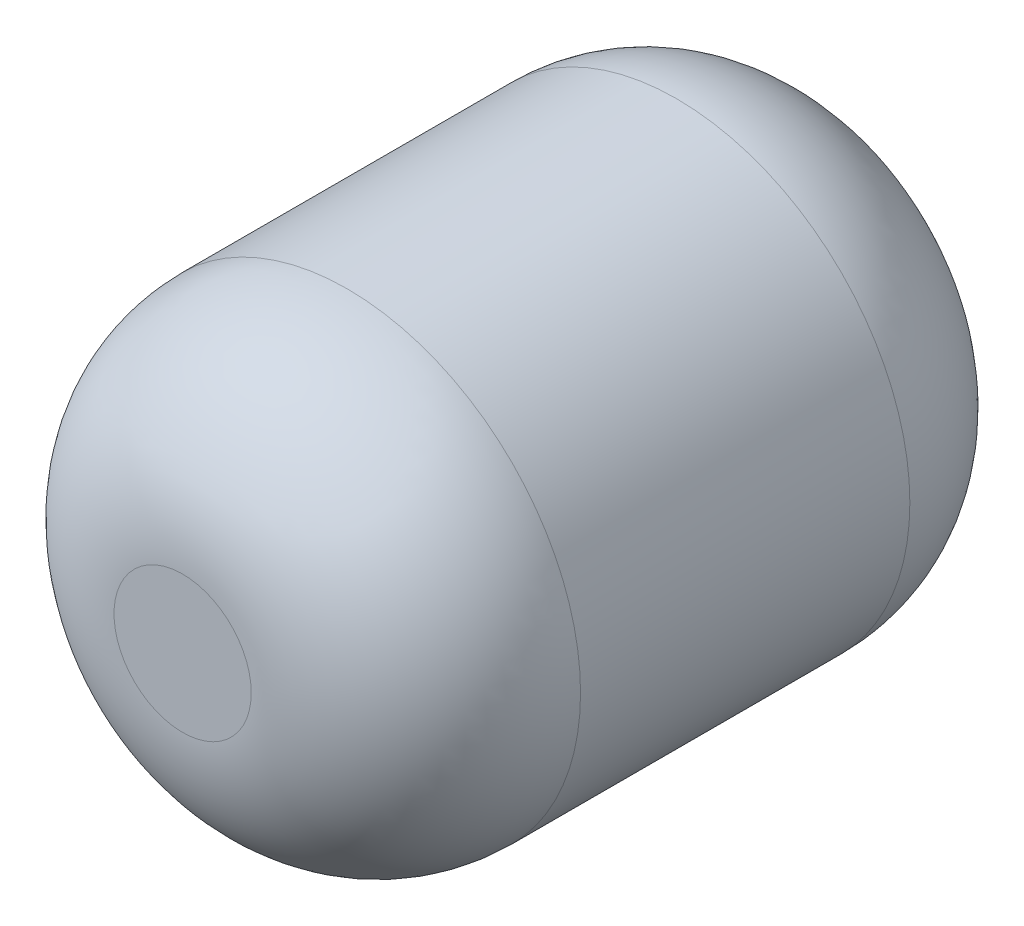
ISO-10303-21;
HEADER;
FILE_DESCRIPTION(('STEP AP214'),'2;1');
FILE_NAME('part.step','',(''),(''),'','','');
FILE_SCHEMA(('AUTOMOTIVE_DESIGN { 1 0 10303 214 1 1 1 1 }'));
ENDSEC;
DATA;
#1=APPLICATION_CONTEXT('core data for automotive mechanical design processes');
#2=APPLICATION_PROTOCOL_DEFINITION('international standard','automotive_design',2000,#1);
#3=PRODUCT_CONTEXT('',#1,'mechanical');
#4=PRODUCT('Part','Part','',(#3));
#5=PRODUCT_RELATED_PRODUCT_CATEGORY('part','',(#4));
#6=PRODUCT_DEFINITION_FORMATION('','',#4);
#7=PRODUCT_DEFINITION_CONTEXT('part definition',#1,'design');
#8=PRODUCT_DEFINITION('design','',#6,#7);
#9=PRODUCT_DEFINITION_SHAPE('','',#8);
#10=(LENGTH_UNIT() NAMED_UNIT(*) SI_UNIT(.MILLI.,.METRE.));
#11=(NAMED_UNIT(*) PLANE_ANGLE_UNIT() SI_UNIT($,.RADIAN.));
#12=(NAMED_UNIT(*) SI_UNIT($,.STERADIAN.) SOLID_ANGLE_UNIT());
#13=UNCERTAINTY_MEASURE_WITH_UNIT(LENGTH_MEASURE(1.E-05),#10,'distance_accuracy_value','');
#14=(GEOMETRIC_REPRESENTATION_CONTEXT(3) GLOBAL_UNCERTAINTY_ASSIGNED_CONTEXT((#13)) GLOBAL_UNIT_ASSIGNED_CONTEXT((#10,
#11,#12)) REPRESENTATION_CONTEXT('',''));
#15=CARTESIAN_POINT('',(0.,0.,0.));
#16=DIRECTION('',(0.,0.,1.));
#17=DIRECTION('',(1.,0.,0.));
#18=AXIS2_PLACEMENT_3D('',#15,#16,#17);
#19=CARTESIAN_POINT('',(0.,0.,304.8));
#20=DIRECTION('',(0.,0.,-1.));
#21=DIRECTION('',(-1.,0.,0.));
#22=AXIS2_PLACEMENT_3D('',#19,#20,#21);
#23=CYLINDRICAL_SURFACE('',#22,107.95);
#24=CARTESIAN_POINT('',(0.,0.,76.1999999999998));
#25=DIRECTION('',(0.,0.,1.));
#26=DIRECTION('',(1.,0.,0.));
#27=AXIS2_PLACEMENT_3D('',#24,#25,#26);
#28=CIRCLE('',#27,107.95);
#29=CARTESIAN_POINT('',(-107.95,0.,76.1999999999998));
#30=VERTEX_POINT('',#29);
#31=EDGE_CURVE('E44',#30,#30,#28,.T.);
#32=CARTESIAN_POINT('',(0.,0.,228.6));
#33=DIRECTION('',(0.,0.,1.));
#34=DIRECTION('',(1.,0.,0.));
#35=AXIS2_PLACEMENT_3D('',#32,#33,#34);
#36=CIRCLE('',#35,107.95);
#37=CARTESIAN_POINT('',(-107.95,0.,228.6));
#38=VERTEX_POINT('',#37);
#39=EDGE_CURVE('E48',#38,#38,#36,.F.);
#40=CARTESIAN_POINT('',(-107.95,0.,76.1999999999998));
#41=CARTESIAN_POINT('',(-107.95,0.,77.7874999999999));
#42=CARTESIAN_POINT('',(-107.95,0.,79.3749999999998));
#43=CARTESIAN_POINT('',(-107.95,0.,82.5499999999999));
#44=CARTESIAN_POINT('',(-107.95,0.,84.1374999999998));
#45=CARTESIAN_POINT('',(-107.95,0.,87.3124999999999));
#46=CARTESIAN_POINT('',(-107.95,0.,88.8999999999998));
#47=CARTESIAN_POINT('',(-107.95,0.,92.0749999999999));
#48=CARTESIAN_POINT('',(-107.95,0.,93.6624999999999));
#49=CARTESIAN_POINT('',(-107.95,0.,96.8374999999999));
#50=CARTESIAN_POINT('',(-107.95,0.,98.4249999999999));
#51=CARTESIAN_POINT('',(-107.95,0.,101.6));
#52=CARTESIAN_POINT('',(-107.95,0.,103.1875));
#53=CARTESIAN_POINT('',(-107.95,0.,106.3625));
#54=CARTESIAN_POINT('',(-107.95,0.,107.95));
#55=CARTESIAN_POINT('',(-107.95,0.,111.125));
#56=CARTESIAN_POINT('',(-107.95,0.,112.7125));
#57=CARTESIAN_POINT('',(-107.95,0.,115.8875));
#58=CARTESIAN_POINT('',(-107.95,0.,117.475));
#59=CARTESIAN_POINT('',(-107.95,0.,120.65));
#60=CARTESIAN_POINT('',(-107.95,0.,122.2375));
#61=CARTESIAN_POINT('',(-107.95,0.,125.4125));
#62=CARTESIAN_POINT('',(-107.95,0.,127.));
#63=CARTESIAN_POINT('',(-107.95,0.,130.175));
#64=CARTESIAN_POINT('',(-107.95,0.,131.7625));
#65=CARTESIAN_POINT('',(-107.95,0.,134.9375));
#66=CARTESIAN_POINT('',(-107.95,0.,136.525));
#67=CARTESIAN_POINT('',(-107.95,0.,139.7));
#68=CARTESIAN_POINT('',(-107.95,0.,141.2875));
#69=CARTESIAN_POINT('',(-107.95,0.,144.4625));
#70=CARTESIAN_POINT('',(-107.95,0.,146.05));
#71=CARTESIAN_POINT('',(-107.95,0.,149.225));
#72=CARTESIAN_POINT('',(-107.95,0.,150.8125));
#73=CARTESIAN_POINT('',(-107.95,0.,153.9875));
#74=CARTESIAN_POINT('',(-107.95,0.,155.575));
#75=CARTESIAN_POINT('',(-107.95,0.,158.75));
#76=CARTESIAN_POINT('',(-107.95,0.,160.3375));
#77=CARTESIAN_POINT('',(-107.95,0.,163.5125));
#78=CARTESIAN_POINT('',(-107.95,0.,165.1));
#79=CARTESIAN_POINT('',(-107.95,0.,168.275));
#80=CARTESIAN_POINT('',(-107.95,0.,169.8625));
#81=CARTESIAN_POINT('',(-107.95,0.,173.0375));
#82=CARTESIAN_POINT('',(-107.95,0.,174.625));
#83=CARTESIAN_POINT('',(-107.95,0.,177.8));
#84=CARTESIAN_POINT('',(-107.95,0.,179.3875));
#85=CARTESIAN_POINT('',(-107.95,0.,182.5625));
#86=CARTESIAN_POINT('',(-107.95,0.,184.15));
#87=CARTESIAN_POINT('',(-107.95,0.,187.325));
#88=CARTESIAN_POINT('',(-107.95,0.,188.9125));
#89=CARTESIAN_POINT('',(-107.95,0.,192.0875));
#90=CARTESIAN_POINT('',(-107.95,0.,193.675));
#91=CARTESIAN_POINT('',(-107.95,0.,196.85));
#92=CARTESIAN_POINT('',(-107.95,0.,198.4375));
#93=CARTESIAN_POINT('',(-107.95,0.,201.6125));
#94=CARTESIAN_POINT('',(-107.95,0.,203.2));
#95=CARTESIAN_POINT('',(-107.95,0.,206.375));
#96=CARTESIAN_POINT('',(-107.95,0.,207.9625));
#97=CARTESIAN_POINT('',(-107.95,0.,211.1375));
#98=CARTESIAN_POINT('',(-107.95,0.,212.725));
#99=CARTESIAN_POINT('',(-107.95,0.,215.9));
#100=CARTESIAN_POINT('',(-107.95,0.,217.4875));
#101=CARTESIAN_POINT('',(-107.95,0.,220.6625));
#102=CARTESIAN_POINT('',(-107.95,0.,222.25));
#103=CARTESIAN_POINT('',(-107.95,0.,225.425));
#104=CARTESIAN_POINT('',(-107.95,0.,227.0125));
#105=CARTESIAN_POINT('',(-107.95,0.,228.6));
#106=B_SPLINE_CURVE_WITH_KNOTS('',3,(#40,#41,#42,#43,#44,#45,#46,#47,#48,#49,#50,#51,#52,#53,
#54,#55,#56,#57,#58,#59,#60,#61,#62,#63,#64,#65,#66,#67,#68,#69,#70,#71,#72,#73,#74,#75,#76,#77,
#78,#79,#80,#81,#82,#83,#84,#85,#86,#87,#88,#89,#90,#91,#92,#93,#94,#95,#96,#97,#98,#99,#100,
#101,#102,#103,#104,#105),.UNSPECIFIED.,.F.,.F.,(4,2,2,2,2,2,2,2,2,2,2,2,2,2,2,2,2,2,2,2,2,2,2,
2,2,2,2,2,2,2,2,2,4),(0.,4.7625,9.52500000000001,14.2875,19.05,23.8125,28.575,33.3375,38.1,
42.8625,47.625,52.3875,57.15,61.9125,66.675,71.4375,76.2,80.9625,85.7250000000001,
90.4875000000001,95.2500000000001,100.0125,104.775,109.5375,114.3,119.0625,123.825,128.5875,
133.35,138.1125,142.875,147.6375,152.4),.UNSPECIFIED.);
#107=EDGE_CURVE('BSEAM33',#30,#38,#106,.T.);
#108=ORIENTED_EDGE('',*,*,#31,.T.);
#109=ORIENTED_EDGE('',*,*,#39,.T.);
#110=ORIENTED_EDGE('',*,*,#107,.T.);
#111=ORIENTED_EDGE('',*,*,#107,.F.);
#112=EDGE_LOOP('',(#108,#110,#109,#111));
#113=FACE_BOUND('',#112,.T.);
#114=ADVANCED_FACE('F33',(#113),#23,.T.);
#115=CARTESIAN_POINT('',(0.,0.,304.8));
#116=DIRECTION('',(0.,0.,1.));
#117=DIRECTION('',(1.,0.,0.));
#118=AXIS2_PLACEMENT_3D('',#115,#116,#117);
#119=PLANE('',#118);
#120=CARTESIAN_POINT('',(0.,0.,304.8));
#121=DIRECTION('',(0.,0.,1.));
#122=DIRECTION('',(1.,0.,0.));
#123=AXIS2_PLACEMENT_3D('',#120,#121,#122);
#124=CIRCLE('',#123,31.75);
#125=CARTESIAN_POINT('',(31.75,0.,304.8));
#126=VERTEX_POINT('',#125);
#127=EDGE_CURVE('E10',#126,#126,#124,.T.);
#128=ORIENTED_EDGE('',*,*,#127,.T.);
#129=EDGE_LOOP('',(#128));
#130=FACE_BOUND('',#129,.T.);
#131=ADVANCED_FACE('F64',(#130),#119,.T.);
#132=CARTESIAN_POINT('',(0.,0.,0.));
#133=DIRECTION('',(0.,0.,1.));
#134=DIRECTION('',(1.,0.,0.));
#135=AXIS2_PLACEMENT_3D('',#132,#133,#134);
#136=PLANE('',#135);
#137=CARTESIAN_POINT('',(0.,0.,0.));
#138=DIRECTION('',(0.,0.,1.));
#139=DIRECTION('',(1.,0.,0.));
#140=AXIS2_PLACEMENT_3D('',#137,#138,#139);
#141=CIRCLE('',#140,31.75);
#142=CARTESIAN_POINT('',(31.75,0.,0.));
#143=VERTEX_POINT('',#142);
#144=EDGE_CURVE('E40',#143,#143,#141,.F.);
#145=ORIENTED_EDGE('',*,*,#144,.T.);
#146=EDGE_LOOP('',(#145));
#147=FACE_BOUND('',#146,.T.);
#148=ADVANCED_FACE('F61',(#147),#136,.F.);
#149=CARTESIAN_POINT('',(0.,0.,76.2));
#150=DIRECTION('',(0.,0.,1.));
#151=DIRECTION('',(1.,0.,0.));
#152=AXIS2_PLACEMENT_3D('',#149,#150,#151);
#153=DEGENERATE_TOROIDAL_SURFACE('',#152,31.75,76.2,.T.);
#154=ORIENTED_EDGE('',*,*,#144,.F.);
#155=EDGE_LOOP('',(#154));
#156=FACE_BOUND('',#155,.T.);
#157=ORIENTED_EDGE('',*,*,#31,.F.);
#158=EDGE_LOOP('',(#157));
#159=FACE_BOUND('',#158,.T.);
#160=ADVANCED_FACE('F57',(#156,#159),#153,.T.);
#161=CARTESIAN_POINT('',(0.,0.,228.6));
#162=DIRECTION('',(0.,0.,1.));
#163=DIRECTION('',(1.,0.,0.));
#164=AXIS2_PLACEMENT_3D('',#161,#162,#163);
#165=DEGENERATE_TOROIDAL_SURFACE('',#164,31.75,76.2,.T.);
#166=ORIENTED_EDGE('',*,*,#39,.F.);
#167=EDGE_LOOP('',(#166));
#168=FACE_BOUND('',#167,.T.);
#169=ORIENTED_EDGE('',*,*,#127,.F.);
#170=EDGE_LOOP('',(#169));
#171=FACE_BOUND('',#170,.T.);
#172=ADVANCED_FACE('F35',(#168,#171),#165,.T.);
#173=CLOSED_SHELL('',(#114,#131,#148,#160,#172));
#174=MANIFOLD_SOLID_BREP('B2',#173);
#175=ADVANCED_BREP_SHAPE_REPRESENTATION('',(#18,#174),#14);
#176=SHAPE_DEFINITION_REPRESENTATION(#9,#175);
ENDSEC;
END-ISO-10303-21;
